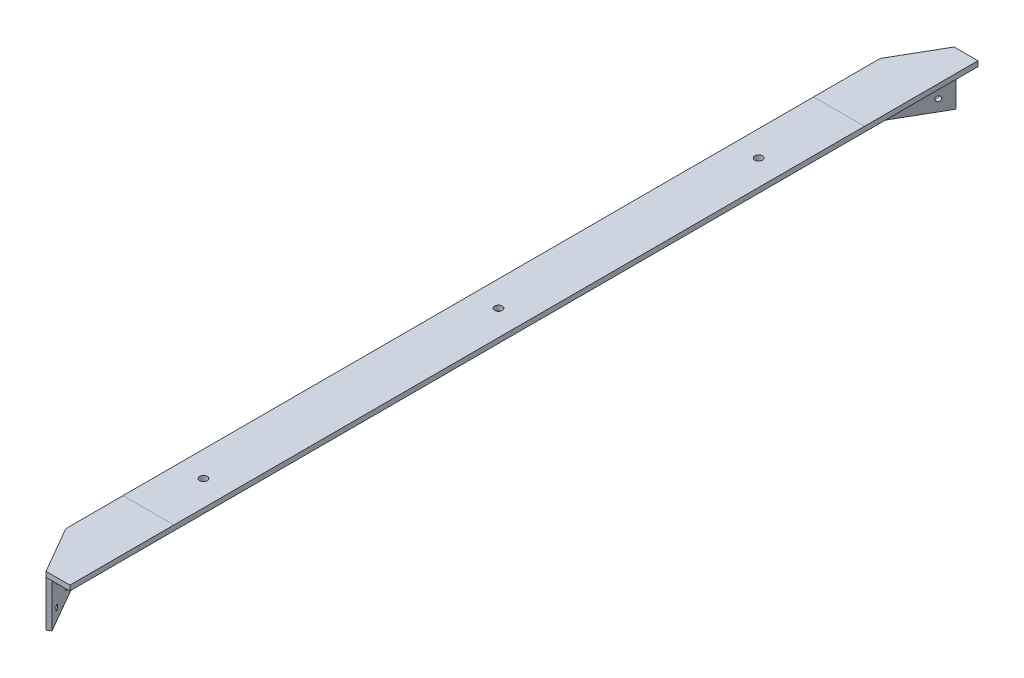
ISO-10303-21;
HEADER;
FILE_DESCRIPTION(('STEP AP214'),'2;1');
FILE_NAME('part.step','',(''),(''),'','','');
FILE_SCHEMA(('AUTOMOTIVE_DESIGN { 1 0 10303 214 1 1 1 1 }'));
ENDSEC;
DATA;
#1=APPLICATION_CONTEXT('core data for automotive mechanical design processes');
#2=APPLICATION_PROTOCOL_DEFINITION('international standard','automotive_design',2000,#1);
#3=PRODUCT_CONTEXT('',#1,'mechanical');
#4=PRODUCT('Part','Part','',(#3));
#5=PRODUCT_RELATED_PRODUCT_CATEGORY('part','',(#4));
#6=PRODUCT_DEFINITION_FORMATION('','',#4);
#7=PRODUCT_DEFINITION_CONTEXT('part definition',#1,'design');
#8=PRODUCT_DEFINITION('design','',#6,#7);
#9=PRODUCT_DEFINITION_SHAPE('','',#8);
#10=(LENGTH_UNIT() NAMED_UNIT(*) SI_UNIT(.MILLI.,.METRE.));
#11=(NAMED_UNIT(*) PLANE_ANGLE_UNIT() SI_UNIT($,.RADIAN.));
#12=(NAMED_UNIT(*) SI_UNIT($,.STERADIAN.) SOLID_ANGLE_UNIT());
#13=UNCERTAINTY_MEASURE_WITH_UNIT(LENGTH_MEASURE(1.E-05),#10,'distance_accuracy_value','');
#14=(GEOMETRIC_REPRESENTATION_CONTEXT(3) GLOBAL_UNCERTAINTY_ASSIGNED_CONTEXT((#13)) GLOBAL_UNIT_ASSIGNED_CONTEXT((#10,
#11,#12)) REPRESENTATION_CONTEXT('',''));
#15=CARTESIAN_POINT('',(0.,0.,0.));
#16=DIRECTION('',(0.,0.,1.));
#17=DIRECTION('',(1.,0.,0.));
#18=AXIS2_PLACEMENT_3D('',#15,#16,#17);
#19=CARTESIAN_POINT('',(-7.99999999999999,8.00000000000001,640.));
#20=DIRECTION('',(0.,-1.,0.));
#21=DIRECTION('',(1.,0.,0.));
#22=AXIS2_PLACEMENT_3D('',#19,#20,#21);
#23=PLANE('',#22);
#24=DIRECTION('',(1.,0.,0.));
#25=VECTOR('',#24,1.);
#26=CARTESIAN_POINT('',(-7.99999999999999,8.00000000000001,550.110508075689));
#27=LINE('',#26,#25);
#28=CARTESIAN_POINT('',(-7.99999999999999,8.00000000000001,550.110508075689));
#29=VERTEX_POINT('',#28);
#30=CARTESIAN_POINT('',(72.,8.00000000000001,550.110508075689));
#31=VERTEX_POINT('',#30);
#32=EDGE_CURVE('E11',#29,#31,#27,.T.);
#33=ORIENTED_EDGE('',*,*,#32,.F.);
#34=DIRECTION('',(0.,0.,-1.));
#35=VECTOR('',#34,1.);
#36=CARTESIAN_POINT('',(-7.99999999999999,8.00000000000001,640.));
#37=LINE('',#36,#35);
#38=CARTESIAN_POINT('',(-7.99999999999999,8.00000000000001,637.320508075689));
#39=VERTEX_POINT('',#38);
#40=EDGE_CURVE('E288',#39,#29,#37,.T.);
#41=ORIENTED_EDGE('',*,*,#40,.F.);
#42=CARTESIAN_POINT('',(2.00000000000001,8.00000000000001,637.320508075689));
#43=DIRECTION('',(0.,-1.,0.));
#44=DIRECTION('',(1.,0.,0.));
#45=AXIS2_PLACEMENT_3D('',#42,#43,#44);
#46=CIRCLE('',#45,10.);
#47=CARTESIAN_POINT('',(-6.66025403784442,8.,642.320508075689));
#48=VERTEX_POINT('',#47);
#49=EDGE_CURVE('E311',#39,#48,#46,.F.);
#50=ORIENTED_EDGE('',*,*,#49,.T.);
#51=DIRECTION('',(0.499999999999995,0.,0.866025403784441));
#52=VECTOR('',#51,1.);
#53=CARTESIAN_POINT('',(-7.99999999999999,8.,640.));
#54=LINE('',#53,#52);
#55=CARTESIAN_POINT('',(34.4999999999996,8.,713.612159321677));
#56=VERTEX_POINT('',#55);
#57=EDGE_CURVE('E274',#48,#56,#54,.T.);
#58=ORIENTED_EDGE('',*,*,#57,.T.);
#59=DIRECTION('',(1.,0.,0.));
#60=VECTOR('',#59,1.);
#61=CARTESIAN_POINT('',(34.4999999999996,8.,713.612159321677));
#62=LINE('',#61,#60);
#63=CARTESIAN_POINT('',(72.,8.,713.612159321677));
#64=VERTEX_POINT('',#63);
#65=EDGE_CURVE('E276',#56,#64,#62,.T.);
#66=ORIENTED_EDGE('',*,*,#65,.T.);
#67=DIRECTION('',(0.,0.,-1.));
#68=VECTOR('',#67,1.);
#69=CARTESIAN_POINT('',(72.,8.00000000000001,640.));
#70=LINE('',#69,#68);
#71=EDGE_CURVE('E293',#64,#31,#70,.T.);
#72=ORIENTED_EDGE('',*,*,#71,.T.);
#73=EDGE_LOOP('',(#33,#41,#50,#58,#66,#72));
#74=FACE_BOUND('',#73,.T.);
#75=ADVANCED_FACE('F45',(#74),#23,.F.);
#76=DIRECTION('',(-1.,0.,0.));
#77=VECTOR('',#76,1.);
#78=CARTESIAN_POINT('',(-7.99999999999999,8.00000000000001,-535.236189627764));
#79=LINE('',#78,#77);
#80=CARTESIAN_POINT('',(72.,8.00000000000001,-535.236189627764));
#81=VERTEX_POINT('',#80);
#82=CARTESIAN_POINT('',(-7.99999999999999,8.00000000000001,-535.236189627764));
#83=VERTEX_POINT('',#82);
#84=EDGE_CURVE('E54',#81,#83,#79,.T.);
#85=ORIENTED_EDGE('',*,*,#84,.F.);
#86=CARTESIAN_POINT('',(72.,8.,-713.612159321677));
#87=VERTEX_POINT('',#86);
#88=EDGE_CURVE('E291',#81,#87,#70,.T.);
#89=ORIENTED_EDGE('',*,*,#88,.T.);
#90=DIRECTION('',(1.,0.,0.));
#91=VECTOR('',#90,1.);
#92=CARTESIAN_POINT('',(34.4999999999996,8.,-713.612159321677));
#93=LINE('',#92,#91);
#94=CARTESIAN_POINT('',(34.4999999999996,8.,-713.612159321677));
#95=VERTEX_POINT('',#94);
#96=EDGE_CURVE('E221',#95,#87,#93,.T.);
#97=ORIENTED_EDGE('',*,*,#96,.F.);
#98=DIRECTION('',(0.499999999999995,0.,-0.866025403784441));
#99=VECTOR('',#98,1.);
#100=CARTESIAN_POINT('',(-7.99999999999999,8.,-640.));
#101=LINE('',#100,#99);
#102=CARTESIAN_POINT('',(-6.66025403784448,8.,-642.320508075689));
#103=VERTEX_POINT('',#102);
#104=EDGE_CURVE('E224',#103,#95,#101,.T.);
#105=ORIENTED_EDGE('',*,*,#104,.F.);
#106=CARTESIAN_POINT('',(2.00000000000001,8.00000000000001,-637.320508075689));
#107=DIRECTION('',(0.,-1.,0.));
#108=DIRECTION('',(1.,0.,0.));
#109=AXIS2_PLACEMENT_3D('',#106,#107,#108);
#110=CIRCLE('',#109,10.);
#111=CARTESIAN_POINT('',(-7.99999999999999,8.00000000000001,-637.320508075689));
#112=VERTEX_POINT('',#111);
#113=EDGE_CURVE('E348',#103,#112,#110,.F.);
#114=ORIENTED_EDGE('',*,*,#113,.T.);
#115=EDGE_CURVE('E287',#83,#112,#37,.T.);
#116=ORIENTED_EDGE('',*,*,#115,.F.);
#117=EDGE_LOOP('',(#85,#89,#97,#105,#114,#116));
#118=FACE_BOUND('',#117,.T.);
#119=ADVANCED_FACE('F386',(#118),#23,.F.);
#120=CARTESIAN_POINT('',(72.,0.,640.));
#121=DIRECTION('',(0.,1.,0.));
#122=DIRECTION('',(-1.,0.,0.));
#123=AXIS2_PLACEMENT_3D('',#120,#121,#122);
#124=PLANE('',#123);
#125=CARTESIAN_POINT('',(32.,0.,-408.889903619654));
#126=DIRECTION('',(0.,1.,0.));
#127=DIRECTION('',(-1.,0.,0.));
#128=AXIS2_PLACEMENT_3D('',#125,#126,#127);
#129=CIRCLE('',#128,6.00000000000001);
#130=CARTESIAN_POINT('',(26.,0.,-408.889903619654));
#131=VERTEX_POINT('',#130);
#132=EDGE_CURVE('E378',#131,#131,#129,.T.);
#133=ORIENTED_EDGE('',*,*,#132,.T.);
#134=EDGE_LOOP('',(#133));
#135=FACE_BOUND('',#134,.T.);
#136=CARTESIAN_POINT('',(32.,0.,0.));
#137=DIRECTION('',(0.,1.,0.));
#138=DIRECTION('',(-1.,0.,0.));
#139=AXIS2_PLACEMENT_3D('',#136,#137,#138);
#140=CIRCLE('',#139,5.99999999999999);
#141=CARTESIAN_POINT('',(26.,0.,0.));
#142=VERTEX_POINT('',#141);
#143=EDGE_CURVE('E509',#142,#142,#140,.T.);
#144=ORIENTED_EDGE('',*,*,#143,.T.);
#145=EDGE_LOOP('',(#144));
#146=FACE_BOUND('',#145,.T.);
#147=CARTESIAN_POINT('',(32.,0.,463.612159321678));
#148=DIRECTION('',(0.,1.,0.));
#149=DIRECTION('',(-1.,0.,0.));
#150=AXIS2_PLACEMENT_3D('',#147,#148,#149);
#151=CIRCLE('',#150,6.00000000000001);
#152=CARTESIAN_POINT('',(26.,0.,463.612159321678));
#153=VERTEX_POINT('',#152);
#154=EDGE_CURVE('E510',#153,#153,#151,.T.);
#155=ORIENTED_EDGE('',*,*,#154,.T.);
#156=EDGE_LOOP('',(#155));
#157=FACE_BOUND('',#156,.T.);
#158=DIRECTION('',(0.,0.,-1.));
#159=VECTOR('',#158,1.);
#160=CARTESIAN_POINT('',(8.00000000000001,0.,0.));
#161=LINE('',#160,#159);
#162=CARTESIAN_POINT('',(8.,0.,637.320508075689));
#163=VERTEX_POINT('',#162);
#164=CARTESIAN_POINT('',(8.00000000000001,0.,0.));
#165=VERTEX_POINT('',#164);
#166=EDGE_CURVE('E324',#163,#165,#161,.T.);
#167=ORIENTED_EDGE('',*,*,#166,.T.);
#168=DIRECTION('',(0.,0.,1.));
#169=VECTOR('',#168,1.);
#170=CARTESIAN_POINT('',(8.,0.,-637.320508075689));
#171=LINE('',#170,#169);
#172=CARTESIAN_POINT('',(8.,0.,-637.320508075689));
#173=VERTEX_POINT('',#172);
#174=EDGE_CURVE('E366',#165,#173,#171,.F.);
#175=ORIENTED_EDGE('',*,*,#174,.T.);
#176=CARTESIAN_POINT('',(10.,0.,-637.320508075689));
#177=DIRECTION('',(0.,1.,0.));
#178=DIRECTION('',(-1.,0.,0.));
#179=AXIS2_PLACEMENT_3D('',#176,#177,#178);
#180=CIRCLE('',#179,2.);
#181=CARTESIAN_POINT('',(8.26794919243096,0.,-638.320508075689));
#182=VERTEX_POINT('',#181);
#183=EDGE_CURVE('E364',#173,#182,#180,.F.);
#184=ORIENTED_EDGE('',*,*,#183,.T.);
#185=DIRECTION('',(0.499999999999996,0.,-0.866025403784441));
#186=VECTOR('',#185,1.);
#187=CARTESIAN_POINT('',(-529.328055191762,0.,292.823085463766));
#188=LINE('',#187,#186);
#189=CARTESIAN_POINT('',(47.4282032302751,0.,-706.14805770654));
#190=VERTEX_POINT('',#189);
#191=EDGE_CURVE('E361',#182,#190,#188,.T.);
#192=ORIENTED_EDGE('',*,*,#191,.T.);
#193=DIRECTION('',(-0.866025403784439,0.,-0.5));
#194=VECTOR('',#193,1.);
#195=CARTESIAN_POINT('',(34.4999999999996,0.,-713.612159321677));
#196=LINE('',#195,#194);
#197=CARTESIAN_POINT('',(34.4999999999996,0.,-713.612159321677));
#198=VERTEX_POINT('',#197);
#199=EDGE_CURVE('E208',#190,#198,#196,.T.);
#200=ORIENTED_EDGE('',*,*,#199,.T.);
#201=DIRECTION('',(1.,0.,0.));
#202=VECTOR('',#201,1.);
#203=CARTESIAN_POINT('',(34.4999999999996,0.,-713.612159321677));
#204=LINE('',#203,#202);
#205=CARTESIAN_POINT('',(72.,0.,-713.612159321677));
#206=VERTEX_POINT('',#205);
#207=EDGE_CURVE('E198',#198,#206,#204,.T.);
#208=ORIENTED_EDGE('',*,*,#207,.T.);
#209=DIRECTION('',(0.,0.,-1.));
#210=VECTOR('',#209,1.);
#211=CARTESIAN_POINT('',(72.,0.,640.));
#212=LINE('',#211,#210);
#213=CARTESIAN_POINT('',(72.,0.,713.612159321677));
#214=VERTEX_POINT('',#213);
#215=EDGE_CURVE('E296',#214,#206,#212,.T.);
#216=ORIENTED_EDGE('',*,*,#215,.F.);
#217=DIRECTION('',(1.,0.,0.));
#218=VECTOR('',#217,1.);
#219=CARTESIAN_POINT('',(34.4999999999996,0.,713.612159321677));
#220=LINE('',#219,#218);
#221=CARTESIAN_POINT('',(34.4999999999996,0.,713.612159321677));
#222=VERTEX_POINT('',#221);
#223=EDGE_CURVE('E273',#222,#214,#220,.T.);
#224=ORIENTED_EDGE('',*,*,#223,.F.);
#225=DIRECTION('',(-0.866025403784439,0.,0.5));
#226=VECTOR('',#225,1.);
#227=CARTESIAN_POINT('',(34.4999999999996,0.,713.612159321677));
#228=LINE('',#227,#226);
#229=CARTESIAN_POINT('',(47.4282032302752,0.,706.14805770654));
#230=VERTEX_POINT('',#229);
#231=EDGE_CURVE('E258',#230,#222,#228,.T.);
#232=ORIENTED_EDGE('',*,*,#231,.F.);
#233=DIRECTION('',(0.499999999999996,0.,0.866025403784441));
#234=VECTOR('',#233,1.);
#235=CARTESIAN_POINT('',(8.26794919243111,0.,638.320508075689));
#236=LINE('',#235,#234);
#237=CARTESIAN_POINT('',(8.26794919243111,0.,638.320508075689));
#238=VERTEX_POINT('',#237);
#239=EDGE_CURVE('E320',#230,#238,#236,.F.);
#240=ORIENTED_EDGE('',*,*,#239,.T.);
#241=CARTESIAN_POINT('',(10.,0.,637.320508075689));
#242=DIRECTION('',(0.,1.,0.));
#243=DIRECTION('',(-1.,0.,0.));
#244=AXIS2_PLACEMENT_3D('',#241,#242,#243);
#245=CIRCLE('',#244,2.);
#246=EDGE_CURVE('E322',#238,#163,#245,.F.);
#247=ORIENTED_EDGE('',*,*,#246,.T.);
#248=EDGE_LOOP('',(#167,#175,#184,#192,#200,#208,#216,#224,#232,#240,#247));
#249=FACE_BOUND('',#248,.T.);
#250=ADVANCED_FACE('F423',(#135,#146,#157,#249),#124,.F.);
#251=CARTESIAN_POINT('',(-8.,-72.,640.));
#252=DIRECTION('',(1.,0.,0.));
#253=DIRECTION('',(0.,1.,0.));
#254=AXIS2_PLACEMENT_3D('',#251,#252,#253);
#255=PLANE('',#254);
#256=ORIENTED_EDGE('',*,*,#40,.T.);
#257=EDGE_CURVE('E292',#29,#83,#37,.T.);
#258=ORIENTED_EDGE('',*,*,#257,.T.);
#259=ORIENTED_EDGE('',*,*,#115,.T.);
#260=DIRECTION('',(0.,-1.,0.));
#261=VECTOR('',#260,1.);
#262=CARTESIAN_POINT('',(-8.,-72.,-637.320508075689));
#263=LINE('',#262,#261);
#264=CARTESIAN_POINT('',(-8.,-72.,-637.320508075689));
#265=VERTEX_POINT('',#264);
#266=EDGE_CURVE('E338',#112,#265,#263,.T.);
#267=ORIENTED_EDGE('',*,*,#266,.T.);
#268=DIRECTION('',(0.,0.,-1.));
#269=VECTOR('',#268,1.);
#270=CARTESIAN_POINT('',(-8.,-72.,640.));
#271=LINE('',#270,#269);
#272=CARTESIAN_POINT('',(-8.,-72.,637.320508075689));
#273=VERTEX_POINT('',#272);
#274=EDGE_CURVE('E302',#273,#265,#271,.T.);
#275=ORIENTED_EDGE('',*,*,#274,.F.);
#276=DIRECTION('',(0.,-1.,0.));
#277=VECTOR('',#276,1.);
#278=CARTESIAN_POINT('',(-8.,-72.,637.320508075689));
#279=LINE('',#278,#277);
#280=EDGE_CURVE('E309',#273,#39,#279,.F.);
#281=ORIENTED_EDGE('',*,*,#280,.T.);
#282=EDGE_LOOP('',(#256,#258,#259,#267,#275,#281));
#283=FACE_BOUND('',#282,.T.);
#284=ADVANCED_FACE('F391',(#283),#255,.F.);
#285=CARTESIAN_POINT('',(0.,-72.,640.));
#286=DIRECTION('',(0.,1.,0.));
#287=DIRECTION('',(0.,0.,1.));
#288=AXIS2_PLACEMENT_3D('',#285,#286,#287);
#289=PLANE('',#288);
#290=ORIENTED_EDGE('',*,*,#274,.T.);
#291=CARTESIAN_POINT('',(2.,-72.,-637.320508075689));
#292=DIRECTION('',(0.,1.,0.));
#293=DIRECTION('',(0.,0.,1.));
#294=AXIS2_PLACEMENT_3D('',#291,#292,#293);
#295=CIRCLE('',#294,10.);
#296=CARTESIAN_POINT('',(-6.66025403784449,-72.,-642.320508075689));
#297=VERTEX_POINT('',#296);
#298=EDGE_CURVE('E207',#265,#297,#295,.F.);
#299=ORIENTED_EDGE('',*,*,#298,.T.);
#300=DIRECTION('',(-0.499999999999996,0.,0.866025403784441));
#301=VECTOR('',#300,1.);
#302=CARTESIAN_POINT('',(-8.,-72.,-640.));
#303=LINE('',#302,#301);
#304=CARTESIAN_POINT('',(34.4999999999996,-72.,-713.612159321677));
#305=VERTEX_POINT('',#304);
#306=EDGE_CURVE('E191',#305,#297,#303,.T.);
#307=ORIENTED_EDGE('',*,*,#306,.F.);
#308=DIRECTION('',(-0.866025403784439,0.,-0.5));
#309=VECTOR('',#308,1.);
#310=CARTESIAN_POINT('',(34.4999999999996,-72.,-713.612159321677));
#311=LINE('',#310,#309);
#312=CARTESIAN_POINT('',(40.4999999999997,-72.,-710.14805770654));
#313=VERTEX_POINT('',#312);
#314=EDGE_CURVE('E206',#313,#305,#311,.T.);
#315=ORIENTED_EDGE('',*,*,#314,.F.);
#316=DIRECTION('',(0.499999999999996,0.,-0.866025403784441));
#317=VECTOR('',#316,1.);
#318=CARTESIAN_POINT('',(40.4999999999997,-72.,-710.14805770654));
#319=LINE('',#318,#317);
#320=CARTESIAN_POINT('',(1.33974596215551,-72.,-642.320508075689));
#321=VERTEX_POINT('',#320);
#322=EDGE_CURVE('E213',#321,#313,#319,.T.);
#323=ORIENTED_EDGE('',*,*,#322,.F.);
#324=CARTESIAN_POINT('',(10.,-72.,-637.320508075689));
#325=DIRECTION('',(0.,1.,0.));
#326=DIRECTION('',(0.,0.,1.));
#327=AXIS2_PLACEMENT_3D('',#324,#325,#326);
#328=CIRCLE('',#327,10.);
#329=CARTESIAN_POINT('',(0.,-72.,-637.320508075689));
#330=VERTEX_POINT('',#329);
#331=EDGE_CURVE('E356',#321,#330,#328,.T.);
#332=ORIENTED_EDGE('',*,*,#331,.T.);
#333=DIRECTION('',(0.,0.,-1.));
#334=VECTOR('',#333,1.);
#335=CARTESIAN_POINT('',(0.,-72.,640.));
#336=LINE('',#335,#334);
#337=CARTESIAN_POINT('',(0.,-72.,637.320508075689));
#338=VERTEX_POINT('',#337);
#339=EDGE_CURVE('E299',#338,#330,#336,.T.);
#340=ORIENTED_EDGE('',*,*,#339,.F.);
#341=CARTESIAN_POINT('',(10.,-72.,637.320508075689));
#342=DIRECTION('',(0.,1.,0.));
#343=DIRECTION('',(0.,0.,1.));
#344=AXIS2_PLACEMENT_3D('',#341,#342,#343);
#345=CIRCLE('',#344,10.);
#346=CARTESIAN_POINT('',(1.33974596215557,-72.,642.320508075689));
#347=VERTEX_POINT('',#346);
#348=EDGE_CURVE('E318',#338,#347,#345,.T.);
#349=ORIENTED_EDGE('',*,*,#348,.T.);
#350=DIRECTION('',(0.499999999999996,0.,0.866025403784441));
#351=VECTOR('',#350,1.);
#352=CARTESIAN_POINT('',(40.4999999999997,-72.,710.14805770654));
#353=LINE('',#352,#351);
#354=CARTESIAN_POINT('',(40.4999999999997,-72.,710.14805770654));
#355=VERTEX_POINT('',#354);
#356=EDGE_CURVE('E259',#347,#355,#353,.T.);
#357=ORIENTED_EDGE('',*,*,#356,.T.);
#358=DIRECTION('',(-0.866025403784439,0.,0.5));
#359=VECTOR('',#358,1.);
#360=CARTESIAN_POINT('',(34.4999999999996,-72.,713.612159321677));
#361=LINE('',#360,#359);
#362=CARTESIAN_POINT('',(34.4999999999996,-72.,713.612159321677));
#363=VERTEX_POINT('',#362);
#364=EDGE_CURVE('E261',#355,#363,#361,.T.);
#365=ORIENTED_EDGE('',*,*,#364,.T.);
#366=DIRECTION('',(-0.499999999999996,0.,-0.866025403784441));
#367=VECTOR('',#366,1.);
#368=CARTESIAN_POINT('',(-8.,-72.,640.));
#369=LINE('',#368,#367);
#370=CARTESIAN_POINT('',(-6.66025403784442,-72.,642.320508075689));
#371=VERTEX_POINT('',#370);
#372=EDGE_CURVE('E263',#363,#371,#369,.T.);
#373=ORIENTED_EDGE('',*,*,#372,.T.);
#374=CARTESIAN_POINT('',(2.,-72.,637.320508075689));
#375=DIRECTION('',(0.,1.,0.));
#376=DIRECTION('',(0.,0.,1.));
#377=AXIS2_PLACEMENT_3D('',#374,#375,#376);
#378=CIRCLE('',#377,10.);
#379=EDGE_CURVE('E307',#371,#273,#378,.F.);
#380=ORIENTED_EDGE('',*,*,#379,.T.);
#381=EDGE_LOOP('',(#290,#299,#307,#315,#323,#332,#340,#349,#357,#365,#373,#380));
#382=FACE_BOUND('',#381,.T.);
#383=ADVANCED_FACE('F204',(#382),#289,.F.);
#384=CARTESIAN_POINT('',(0.,0.,640.));
#385=DIRECTION('',(-1.,0.,0.));
#386=DIRECTION('',(0.,-1.,0.));
#387=AXIS2_PLACEMENT_3D('',#384,#385,#386);
#388=PLANE('',#387);
#389=DIRECTION('',(0.,1.,0.));
#390=VECTOR('',#389,1.);
#391=CARTESIAN_POINT('',(0.,0.,-637.320508075689));
#392=LINE('',#391,#390);
#393=CARTESIAN_POINT('',(0.,-8.,-637.320508075689));
#394=VERTEX_POINT('',#393);
#395=EDGE_CURVE('E351',#330,#394,#392,.T.);
#396=ORIENTED_EDGE('',*,*,#395,.T.);
#397=DIRECTION('',(0.,0.,1.));
#398=VECTOR('',#397,1.);
#399=CARTESIAN_POINT('',(0.,-8.,0.));
#400=LINE('',#399,#398);
#401=CARTESIAN_POINT('',(0.,-8.,0.));
#402=VERTEX_POINT('',#401);
#403=EDGE_CURVE('E358',#394,#402,#400,.T.);
#404=ORIENTED_EDGE('',*,*,#403,.T.);
#405=DIRECTION('',(0.,0.,-1.));
#406=VECTOR('',#405,1.);
#407=CARTESIAN_POINT('',(0.,-8.,637.320508075689));
#408=LINE('',#407,#406);
#409=CARTESIAN_POINT('',(0.,-8.00000000000001,637.320508075689));
#410=VERTEX_POINT('',#409);
#411=EDGE_CURVE('E327',#402,#410,#408,.F.);
#412=ORIENTED_EDGE('',*,*,#411,.T.);
#413=DIRECTION('',(0.,1.,0.));
#414=VECTOR('',#413,1.);
#415=CARTESIAN_POINT('',(0.,-72.,637.320508075689));
#416=LINE('',#415,#414);
#417=EDGE_CURVE('E316',#410,#338,#416,.F.);
#418=ORIENTED_EDGE('',*,*,#417,.T.);
#419=ORIENTED_EDGE('',*,*,#339,.T.);
#420=EDGE_LOOP('',(#396,#404,#412,#418,#419));
#421=FACE_BOUND('',#420,.T.);
#422=ADVANCED_FACE('F443',(#421),#388,.F.);
#423=CARTESIAN_POINT('',(72.,8.00000000000001,640.));
#424=DIRECTION('',(-1.,0.,0.));
#425=DIRECTION('',(0.,0.,1.));
#426=AXIS2_PLACEMENT_3D('',#423,#424,#425);
#427=PLANE('',#426);
#428=ORIENTED_EDGE('',*,*,#215,.T.);
#429=DIRECTION('',(0.,-1.,0.));
#430=VECTOR('',#429,1.);
#431=CARTESIAN_POINT('',(72.,8.,-713.612159321677));
#432=LINE('',#431,#430);
#433=EDGE_CURVE('E229',#87,#206,#432,.T.);
#434=ORIENTED_EDGE('',*,*,#433,.F.);
#435=ORIENTED_EDGE('',*,*,#88,.F.);
#436=EDGE_CURVE('E297',#31,#81,#70,.T.);
#437=ORIENTED_EDGE('',*,*,#436,.F.);
#438=ORIENTED_EDGE('',*,*,#71,.F.);
#439=DIRECTION('',(0.,-1.,0.));
#440=VECTOR('',#439,1.);
#441=CARTESIAN_POINT('',(72.,8.,713.612159321677));
#442=LINE('',#441,#440);
#443=EDGE_CURVE('E279',#64,#214,#442,.T.);
#444=ORIENTED_EDGE('',*,*,#443,.T.);
#445=EDGE_LOOP('',(#428,#434,#435,#437,#438,#444));
#446=FACE_BOUND('',#445,.T.);
#447=ADVANCED_FACE('F417',(#446),#427,.F.);
#448=CARTESIAN_POINT('',(32.,8.00000000000001,-408.889903619654));
#449=DIRECTION('',(0.,1.,0.));
#450=DIRECTION('',(-1.,0.,0.));
#451=AXIS2_PLACEMENT_3D('',#448,#449,#450);
#452=CIRCLE('',#451,6.00000000000001);
#453=CARTESIAN_POINT('',(26.,8.00000000000001,-408.889903619654));
#454=VERTEX_POINT('',#453);
#455=EDGE_CURVE('E500',#454,#454,#452,.T.);
#456=ORIENTED_EDGE('',*,*,#455,.F.);
#457=EDGE_LOOP('',(#456));
#458=FACE_BOUND('',#457,.T.);
#459=CARTESIAN_POINT('',(32.,8.00000000000001,0.));
#460=DIRECTION('',(0.,1.,0.));
#461=DIRECTION('',(-1.,0.,0.));
#462=AXIS2_PLACEMENT_3D('',#459,#460,#461);
#463=CIRCLE('',#462,5.99999999999999);
#464=CARTESIAN_POINT('',(26.,8.00000000000001,0.));
#465=VERTEX_POINT('',#464);
#466=EDGE_CURVE('E504',#465,#465,#463,.T.);
#467=ORIENTED_EDGE('',*,*,#466,.F.);
#468=EDGE_LOOP('',(#467));
#469=FACE_BOUND('',#468,.T.);
#470=CARTESIAN_POINT('',(32.,8.00000000000001,463.612159321678));
#471=DIRECTION('',(0.,1.,0.));
#472=DIRECTION('',(-1.,0.,0.));
#473=AXIS2_PLACEMENT_3D('',#470,#471,#472);
#474=CIRCLE('',#473,6.00000000000001);
#475=CARTESIAN_POINT('',(26.,8.00000000000001,463.612159321678));
#476=VERTEX_POINT('',#475);
#477=EDGE_CURVE('E507',#476,#476,#474,.T.);
#478=ORIENTED_EDGE('',*,*,#477,.F.);
#479=EDGE_LOOP('',(#478));
#480=FACE_BOUND('',#479,.T.);
#481=ORIENTED_EDGE('',*,*,#257,.F.);
#482=ORIENTED_EDGE('',*,*,#32,.T.);
#483=ORIENTED_EDGE('',*,*,#436,.T.);
#484=ORIENTED_EDGE('',*,*,#84,.T.);
#485=EDGE_LOOP('',(#481,#482,#483,#484));
#486=FACE_BOUND('',#485,.T.);
#487=ADVANCED_FACE('F384',(#458,#469,#480,#486),#23,.F.);
#488=CARTESIAN_POINT('',(-7.99999999999999,8.,640.));
#489=DIRECTION('',(0.866025403784441,0.,-0.499999999999995));
#490=DIRECTION('',(-0.499999999999995,0.,-0.866025403784441));
#491=AXIS2_PLACEMENT_3D('',#488,#489,#490);
#492=PLANE('',#491);
#493=CARTESIAN_POINT('',(24.3749999999998,-54.,696.075144895043));
#494=DIRECTION('',(0.866025403784441,0.,-0.499999999999995));
#495=DIRECTION('',(-0.499999999999995,0.,-0.866025403784441));
#496=AXIS2_PLACEMENT_3D('',#493,#494,#495);
#497=CIRCLE('',#496,4.00000000000006);
#498=CARTESIAN_POINT('',(22.3749999999998,-54.,692.611043279905));
#499=VERTEX_POINT('',#498);
#500=EDGE_CURVE('E255',#499,#499,#497,.T.);
#501=ORIENTED_EDGE('',*,*,#500,.T.);
#502=EDGE_LOOP('',(#501));
#503=FACE_BOUND('',#502,.T.);
#504=CARTESIAN_POINT('',(4.12499999999999,-54.,661.001116041773));
#505=DIRECTION('',(0.866025403784441,0.,-0.499999999999995));
#506=DIRECTION('',(-0.499999999999995,0.,-0.866025403784441));
#507=AXIS2_PLACEMENT_3D('',#504,#505,#506);
#508=CIRCLE('',#507,3.99999999999997);
#509=CARTESIAN_POINT('',(2.12500000000002,-54.,657.537014426635));
#510=VERTEX_POINT('',#509);
#511=EDGE_CURVE('E252',#510,#510,#508,.T.);
#512=ORIENTED_EDGE('',*,*,#511,.T.);
#513=EDGE_LOOP('',(#512));
#514=FACE_BOUND('',#513,.T.);
#515=CARTESIAN_POINT('',(4.12499999999999,-18.,661.001116041773));
#516=DIRECTION('',(0.866025403784441,0.,-0.499999999999995));
#517=DIRECTION('',(-0.499999999999995,0.,-0.866025403784441));
#518=AXIS2_PLACEMENT_3D('',#515,#516,#517);
#519=CIRCLE('',#518,3.99999999999997);
#520=CARTESIAN_POINT('',(2.12500000000002,-18.,657.537014426635));
#521=VERTEX_POINT('',#520);
#522=EDGE_CURVE('E249',#521,#521,#519,.T.);
#523=ORIENTED_EDGE('',*,*,#522,.T.);
#524=EDGE_LOOP('',(#523));
#525=FACE_BOUND('',#524,.T.);
#526=CARTESIAN_POINT('',(24.3749999999998,-18.,696.075144895043));
#527=DIRECTION('',(0.866025403784441,0.,-0.499999999999995));
#528=DIRECTION('',(-0.499999999999995,0.,-0.866025403784441));
#529=AXIS2_PLACEMENT_3D('',#526,#527,#528);
#530=CIRCLE('',#529,4.00000000000006);
#531=CARTESIAN_POINT('',(22.3749999999998,-18.,692.611043279905));
#532=VERTEX_POINT('',#531);
#533=EDGE_CURVE('E246',#532,#532,#530,.T.);
#534=ORIENTED_EDGE('',*,*,#533,.T.);
#535=EDGE_LOOP('',(#534));
#536=FACE_BOUND('',#535,.T.);
#537=ORIENTED_EDGE('',*,*,#57,.F.);
#538=DIRECTION('',(0.,-1.,0.));
#539=VECTOR('',#538,1.);
#540=CARTESIAN_POINT('',(-6.66025403784442,8.,642.320508075689));
#541=LINE('',#540,#539);
#542=EDGE_CURVE('E304',#48,#371,#541,.T.);
#543=ORIENTED_EDGE('',*,*,#542,.T.);
#544=ORIENTED_EDGE('',*,*,#372,.F.);
#545=DIRECTION('',(0.,1.,0.));
#546=VECTOR('',#545,1.);
#547=CARTESIAN_POINT('',(34.4999999999996,-72.,713.612159321677));
#548=LINE('',#547,#546);
#549=EDGE_CURVE('E266',#363,#222,#548,.T.);
#550=ORIENTED_EDGE('',*,*,#549,.T.);
#551=DIRECTION('',(0.,-1.,0.));
#552=VECTOR('',#551,1.);
#553=CARTESIAN_POINT('',(34.4999999999996,8.,713.612159321677));
#554=LINE('',#553,#552);
#555=EDGE_CURVE('E284',#56,#222,#554,.T.);
#556=ORIENTED_EDGE('',*,*,#555,.F.);
#557=EDGE_LOOP('',(#537,#543,#544,#550,#556));
#558=FACE_BOUND('',#557,.T.);
#559=ADVANCED_FACE('F403',(#503,#514,#525,#536,#558),#492,.F.);
#560=CARTESIAN_POINT('',(34.4999999999996,8.,713.612159321677));
#561=DIRECTION('',(0.,0.,-1.));
#562=DIRECTION('',(-1.,0.,0.));
#563=AXIS2_PLACEMENT_3D('',#560,#561,#562);
#564=PLANE('',#563);
#565=ORIENTED_EDGE('',*,*,#223,.T.);
#566=ORIENTED_EDGE('',*,*,#443,.F.);
#567=ORIENTED_EDGE('',*,*,#65,.F.);
#568=ORIENTED_EDGE('',*,*,#555,.T.);
#569=EDGE_LOOP('',(#565,#566,#567,#568));
#570=FACE_BOUND('',#569,.T.);
#571=ADVANCED_FACE('F415',(#570),#564,.F.);
#572=CARTESIAN_POINT('',(40.4999999999997,-72.,710.14805770654));
#573=DIRECTION('',(-0.866025403784441,0.,0.499999999999996));
#574=DIRECTION('',(0.499999999999996,0.,0.866025403784441));
#575=AXIS2_PLACEMENT_3D('',#572,#573,#574);
#576=PLANE('',#575);
#577=CARTESIAN_POINT('',(30.3749999999997,-54.,692.611043279905));
#578=DIRECTION('',(0.866025403784441,0.,-0.499999999999996));
#579=DIRECTION('',(0.499999999999996,0.,0.866025403784441));
#580=AXIS2_PLACEMENT_3D('',#577,#578,#579);
#581=CIRCLE('',#580,4.00000000000006);
#582=CARTESIAN_POINT('',(32.3749999999997,-54.,696.075144895043));
#583=VERTEX_POINT('',#582);
#584=EDGE_CURVE('E240',#583,#583,#581,.T.);
#585=ORIENTED_EDGE('',*,*,#584,.F.);
#586=EDGE_LOOP('',(#585));
#587=FACE_BOUND('',#586,.T.);
#588=CARTESIAN_POINT('',(10.1249999999999,-54.,657.537014426635));
#589=DIRECTION('',(0.866025403784441,0.,-0.499999999999996));
#590=DIRECTION('',(-0.499999999999996,0.,-0.866025403784441));
#591=AXIS2_PLACEMENT_3D('',#588,#589,#590);
#592=CIRCLE('',#591,3.99999999999997);
#593=CARTESIAN_POINT('',(8.12499999999997,-54.,654.072912811497));
#594=VERTEX_POINT('',#593);
#595=EDGE_CURVE('E237',#594,#594,#592,.T.);
#596=ORIENTED_EDGE('',*,*,#595,.F.);
#597=EDGE_LOOP('',(#596));
#598=FACE_BOUND('',#597,.T.);
#599=CARTESIAN_POINT('',(10.1249999999999,-18.,657.537014426635));
#600=DIRECTION('',(0.866025403784441,0.,-0.499999999999996));
#601=DIRECTION('',(0.499999999999996,0.,0.866025403784441));
#602=AXIS2_PLACEMENT_3D('',#599,#600,#601);
#603=CIRCLE('',#602,3.99999999999997);
#604=CARTESIAN_POINT('',(12.1249999999999,-18.,661.001116041773));
#605=VERTEX_POINT('',#604);
#606=EDGE_CURVE('E233',#605,#605,#603,.T.);
#607=ORIENTED_EDGE('',*,*,#606,.F.);
#608=EDGE_LOOP('',(#607));
#609=FACE_BOUND('',#608,.T.);
#610=CARTESIAN_POINT('',(30.3749999999997,-18.,692.611043279905));
#611=DIRECTION('',(0.866025403784441,0.,-0.499999999999996));
#612=DIRECTION('',(-0.499999999999996,0.,-0.866025403784441));
#613=AXIS2_PLACEMENT_3D('',#610,#611,#612);
#614=CIRCLE('',#613,4.00000000000006);
#615=CARTESIAN_POINT('',(28.3749999999997,-18.,689.146941664767));
#616=VERTEX_POINT('',#615);
#617=EDGE_CURVE('E236',#616,#616,#614,.T.);
#618=ORIENTED_EDGE('',*,*,#617,.F.);
#619=EDGE_LOOP('',(#618));
#620=FACE_BOUND('',#619,.T.);
#621=DIRECTION('',(0.,1.,0.));
#622=VECTOR('',#621,1.);
#623=CARTESIAN_POINT('',(1.33974596215556,0.,642.320508075689));
#624=LINE('',#623,#622);
#625=CARTESIAN_POINT('',(1.33974596215556,-8.,642.320508075689));
#626=VERTEX_POINT('',#625);
#627=EDGE_CURVE('E313',#347,#626,#624,.T.);
#628=ORIENTED_EDGE('',*,*,#627,.T.);
#629=DIRECTION('',(0.499999999999996,0.,0.866025403784441));
#630=VECTOR('',#629,1.);
#631=CARTESIAN_POINT('',(40.4999999999996,-7.99999999999999,710.14805770654));
#632=LINE('',#631,#630);
#633=CARTESIAN_POINT('',(40.4999999999997,-7.99999999999999,710.14805770654));
#634=VERTEX_POINT('',#633);
#635=EDGE_CURVE('E331',#626,#634,#632,.T.);
#636=ORIENTED_EDGE('',*,*,#635,.T.);
#637=DIRECTION('',(0.,1.,0.));
#638=VECTOR('',#637,1.);
#639=CARTESIAN_POINT('',(40.4999999999997,-72.,710.14805770654));
#640=LINE('',#639,#638);
#641=EDGE_CURVE('E270',#355,#634,#640,.T.);
#642=ORIENTED_EDGE('',*,*,#641,.F.);
#643=ORIENTED_EDGE('',*,*,#356,.F.);
#644=EDGE_LOOP('',(#628,#636,#642,#643));
#645=FACE_BOUND('',#644,.T.);
#646=ADVANCED_FACE('F454',(#587,#598,#609,#620,#645),#576,.F.);
#647=CARTESIAN_POINT('',(34.4999999999996,-72.,713.612159321677));
#648=DIRECTION('',(-0.5,0.,-0.866025403784439));
#649=DIRECTION('',(-0.866025403784439,0.,0.5));
#650=AXIS2_PLACEMENT_3D('',#647,#648,#649);
#651=PLANE('',#650);
#652=ORIENTED_EDGE('',*,*,#231,.T.);
#653=ORIENTED_EDGE('',*,*,#549,.F.);
#654=ORIENTED_EDGE('',*,*,#364,.F.);
#655=ORIENTED_EDGE('',*,*,#641,.T.);
#656=CARTESIAN_POINT('',(47.4282032302752,-7.99999999999999,706.14805770654));
#657=DIRECTION('',(-0.5,0.,-0.866025403784439));
#658=DIRECTION('',(-0.866025403784439,0.,0.5));
#659=AXIS2_PLACEMENT_3D('',#656,#657,#658);
#660=CIRCLE('',#659,8.);
#661=EDGE_CURVE('E335',#634,#230,#660,.T.);
#662=ORIENTED_EDGE('',*,*,#661,.T.);
#663=EDGE_LOOP('',(#652,#653,#654,#655,#662));
#664=FACE_BOUND('',#663,.T.);
#665=ADVANCED_FACE('F410',(#664),#651,.F.);
#666=CARTESIAN_POINT('',(23.4467967697242,-18.,696.611043279905));
#667=DIRECTION('',(0.866025403784441,0.,-0.499999999999996));
#668=DIRECTION('',(-0.499999999999996,0.,-0.866025403784441));
#669=AXIS2_PLACEMENT_3D('',#666,#667,#668);
#670=CYLINDRICAL_SURFACE('',#669,4.00000000000006);
#671=ORIENTED_EDGE('',*,*,#617,.T.);
#672=EDGE_LOOP('',(#671));
#673=FACE_BOUND('',#672,.T.);
#674=ORIENTED_EDGE('',*,*,#533,.F.);
#675=EDGE_LOOP('',(#674));
#676=FACE_BOUND('',#675,.T.);
#677=ADVANCED_FACE('F580',(#673,#676),#670,.F.);
#678=CARTESIAN_POINT('',(3.19679676972441,-18.,661.537014426635));
#679=DIRECTION('',(0.866025403784441,0.,-0.499999999999996));
#680=DIRECTION('',(-0.499999999999996,0.,-0.866025403784441));
#681=AXIS2_PLACEMENT_3D('',#678,#679,#680);
#682=CYLINDRICAL_SURFACE('',#681,3.99999999999997);
#683=ORIENTED_EDGE('',*,*,#606,.T.);
#684=EDGE_LOOP('',(#683));
#685=FACE_BOUND('',#684,.T.);
#686=ORIENTED_EDGE('',*,*,#522,.F.);
#687=EDGE_LOOP('',(#686));
#688=FACE_BOUND('',#687,.T.);
#689=ADVANCED_FACE('F576',(#685,#688),#682,.F.);
#690=CARTESIAN_POINT('',(3.19679676972441,-54.,661.537014426635));
#691=DIRECTION('',(0.866025403784441,0.,-0.499999999999996));
#692=DIRECTION('',(-0.499999999999996,0.,-0.866025403784441));
#693=AXIS2_PLACEMENT_3D('',#690,#691,#692);
#694=CYLINDRICAL_SURFACE('',#693,3.99999999999997);
#695=ORIENTED_EDGE('',*,*,#595,.T.);
#696=EDGE_LOOP('',(#695));
#697=FACE_BOUND('',#696,.T.);
#698=ORIENTED_EDGE('',*,*,#511,.F.);
#699=EDGE_LOOP('',(#698));
#700=FACE_BOUND('',#699,.T.);
#701=ADVANCED_FACE('F579',(#697,#700),#694,.F.);
#702=CARTESIAN_POINT('',(23.4467967697242,-54.,696.611043279905));
#703=DIRECTION('',(0.866025403784441,0.,-0.499999999999996));
#704=DIRECTION('',(-0.499999999999996,0.,-0.866025403784441));
#705=AXIS2_PLACEMENT_3D('',#702,#703,#704);
#706=CYLINDRICAL_SURFACE('',#705,4.00000000000006);
#707=ORIENTED_EDGE('',*,*,#584,.T.);
#708=EDGE_LOOP('',(#707));
#709=FACE_BOUND('',#708,.T.);
#710=ORIENTED_EDGE('',*,*,#500,.F.);
#711=EDGE_LOOP('',(#710));
#712=FACE_BOUND('',#711,.T.);
#713=ADVANCED_FACE('F584',(#709,#712),#706,.F.);
#714=CARTESIAN_POINT('',(2.00000000000001,8.,637.320508075689));
#715=DIRECTION('',(0.,-1.,0.));
#716=DIRECTION('',(0.,0.,-1.));
#717=AXIS2_PLACEMENT_3D('',#714,#715,#716);
#718=CYLINDRICAL_SURFACE('',#717,10.);
#719=ORIENTED_EDGE('',*,*,#49,.F.);
#720=ORIENTED_EDGE('',*,*,#280,.F.);
#721=ORIENTED_EDGE('',*,*,#379,.F.);
#722=ORIENTED_EDGE('',*,*,#542,.F.);
#723=EDGE_LOOP('',(#719,#720,#721,#722));
#724=FACE_BOUND('',#723,.T.);
#725=ADVANCED_FACE('F400',(#724),#718,.T.);
#726=CARTESIAN_POINT('',(10.,-72.,637.320508075689));
#727=DIRECTION('',(0.,-1.,0.));
#728=DIRECTION('',(1.,0.,0.));
#729=AXIS2_PLACEMENT_3D('',#726,#727,#728);
#730=CYLINDRICAL_SURFACE('',#729,10.);
#731=ORIENTED_EDGE('',*,*,#417,.F.);
#732=CARTESIAN_POINT('',(10.,-8.00000000000001,637.320508075689));
#733=DIRECTION('',(0.,1.,0.));
#734=DIRECTION('',(-1.,0.,0.));
#735=AXIS2_PLACEMENT_3D('',#732,#733,#734);
#736=CIRCLE('',#735,10.);
#737=EDGE_CURVE('E329',#410,#626,#736,.T.);
#738=ORIENTED_EDGE('',*,*,#737,.T.);
#739=ORIENTED_EDGE('',*,*,#627,.F.);
#740=ORIENTED_EDGE('',*,*,#348,.F.);
#741=EDGE_LOOP('',(#731,#738,#739,#740));
#742=FACE_BOUND('',#741,.T.);
#743=ADVANCED_FACE('F450',(#742),#730,.F.);
#744=CARTESIAN_POINT('',(47.4282032302752,-7.99999999999999,706.14805770654));
#745=DIRECTION('',(-0.499999999999996,0.,-0.866025403784441));
#746=DIRECTION('',(-0.866025403784441,0.,0.499999999999996));
#747=AXIS2_PLACEMENT_3D('',#744,#745,#746);
#748=CYLINDRICAL_SURFACE('',#747,8.);
#749=ORIENTED_EDGE('',*,*,#661,.F.);
#750=ORIENTED_EDGE('',*,*,#635,.F.);
#751=CARTESIAN_POINT('',(8.26794919243111,-8.,638.320508075689));
#752=DIRECTION('',(0.499999999999999,0.,0.866025403784439));
#753=DIRECTION('',(0.866025403784439,0.,-0.499999999999999));
#754=AXIS2_PLACEMENT_3D('',#751,#752,#753);
#755=CIRCLE('',#754,8.);
#756=EDGE_CURVE('E243',#238,#626,#755,.T.);
#757=ORIENTED_EDGE('',*,*,#756,.F.);
#758=ORIENTED_EDGE('',*,*,#239,.F.);
#759=EDGE_LOOP('',(#749,#750,#757,#758));
#760=FACE_BOUND('',#759,.T.);
#761=ADVANCED_FACE('F458',(#760),#748,.F.);
#762=CARTESIAN_POINT('',(10.,-8.00000000000001,637.320508075689));
#763=DIRECTION('',(0.,1.,0.));
#764=DIRECTION('',(-1.,0.,0.));
#765=AXIS2_PLACEMENT_3D('',#762,#763,#764);
#766=DEGENERATE_TOROIDAL_SURFACE('',#765,2.,8.,.T.);
#767=ORIENTED_EDGE('',*,*,#756,.T.);
#768=ORIENTED_EDGE('',*,*,#737,.F.);
#769=CARTESIAN_POINT('',(8.,-8.,637.320508075689));
#770=DIRECTION('',(0.,0.,1.));
#771=DIRECTION('',(1.,0.,0.));
#772=AXIS2_PLACEMENT_3D('',#769,#770,#771);
#773=CIRCLE('',#772,8.);
#774=EDGE_CURVE('E232',#163,#410,#773,.T.);
#775=ORIENTED_EDGE('',*,*,#774,.F.);
#776=ORIENTED_EDGE('',*,*,#246,.F.);
#777=EDGE_LOOP('',(#767,#768,#775,#776));
#778=FACE_BOUND('',#777,.T.);
#779=ADVANCED_FACE('F462',(#778),#766,.F.);
#780=CARTESIAN_POINT('',(8.00000000000001,-8.,640.));
#781=DIRECTION('',(0.,0.,1.));
#782=DIRECTION('',(1.,0.,0.));
#783=AXIS2_PLACEMENT_3D('',#780,#781,#782);
#784=CYLINDRICAL_SURFACE('',#783,8.);
#785=ORIENTED_EDGE('',*,*,#774,.T.);
#786=ORIENTED_EDGE('',*,*,#411,.F.);
#787=CARTESIAN_POINT('',(8.00000000000001,-8.,0.));
#788=DIRECTION('',(0.,0.,-1.));
#789=DIRECTION('',(-1.,0.,0.));
#790=AXIS2_PLACEMENT_3D('',#787,#788,#789);
#791=CIRCLE('',#790,8.);
#792=EDGE_CURVE('E333',#165,#402,#791,.F.);
#793=ORIENTED_EDGE('',*,*,#792,.F.);
#794=ORIENTED_EDGE('',*,*,#166,.F.);
#795=EDGE_LOOP('',(#785,#786,#793,#794));
#796=FACE_BOUND('',#795,.T.);
#797=ADVANCED_FACE('F469',(#796),#784,.F.);
#798=CARTESIAN_POINT('',(34.4999999999996,8.,-713.612159321677));
#799=DIRECTION('',(0.,0.,-1.));
#800=DIRECTION('',(-1.,0.,0.));
#801=AXIS2_PLACEMENT_3D('',#798,#799,#800);
#802=PLANE('',#801);
#803=ORIENTED_EDGE('',*,*,#207,.F.);
#804=DIRECTION('',(0.,-1.,0.));
#805=VECTOR('',#804,1.);
#806=CARTESIAN_POINT('',(34.4999999999996,8.,-713.612159321677));
#807=LINE('',#806,#805);
#808=EDGE_CURVE('E194',#95,#198,#807,.T.);
#809=ORIENTED_EDGE('',*,*,#808,.F.);
#810=ORIENTED_EDGE('',*,*,#96,.T.);
#811=ORIENTED_EDGE('',*,*,#433,.T.);
#812=EDGE_LOOP('',(#803,#809,#810,#811));
#813=FACE_BOUND('',#812,.T.);
#814=ADVANCED_FACE('F421',(#813),#802,.T.);
#815=CARTESIAN_POINT('',(-7.99999999999999,8.,-640.));
#816=DIRECTION('',(-0.866025403784441,0.,-0.499999999999995));
#817=DIRECTION('',(-0.499999999999995,0.,0.866025403784441));
#818=AXIS2_PLACEMENT_3D('',#815,#816,#817);
#819=PLANE('',#818);
#820=CARTESIAN_POINT('',(24.3749999999998,-54.,-696.075144895043));
#821=DIRECTION('',(-0.866025403784441,0.,-0.499999999999995));
#822=DIRECTION('',(-0.499999999999995,0.,0.866025403784441));
#823=AXIS2_PLACEMENT_3D('',#820,#821,#822);
#824=CIRCLE('',#823,4.00000000000006);
#825=CARTESIAN_POINT('',(22.3749999999998,-54.,-692.611043279905));
#826=VERTEX_POINT('',#825);
#827=EDGE_CURVE('E219',#826,#826,#824,.F.);
#828=ORIENTED_EDGE('',*,*,#827,.T.);
#829=EDGE_LOOP('',(#828));
#830=FACE_BOUND('',#829,.T.);
#831=CARTESIAN_POINT('',(4.12499999999999,-54.,-661.001116041773));
#832=DIRECTION('',(-0.866025403784441,0.,-0.499999999999995));
#833=DIRECTION('',(-0.499999999999995,0.,0.866025403784441));
#834=AXIS2_PLACEMENT_3D('',#831,#832,#833);
#835=CIRCLE('',#834,3.99999999999997);
#836=CARTESIAN_POINT('',(2.12500000000002,-54.,-657.537014426635));
#837=VERTEX_POINT('',#836);
#838=EDGE_CURVE('E535',#837,#837,#835,.F.);
#839=ORIENTED_EDGE('',*,*,#838,.T.);
#840=EDGE_LOOP('',(#839));
#841=FACE_BOUND('',#840,.T.);
#842=CARTESIAN_POINT('',(4.12499999999999,-18.,-661.001116041773));
#843=DIRECTION('',(-0.866025403784441,0.,-0.499999999999995));
#844=DIRECTION('',(-0.499999999999995,0.,0.866025403784441));
#845=AXIS2_PLACEMENT_3D('',#842,#843,#844);
#846=CIRCLE('',#845,3.99999999999997);
#847=CARTESIAN_POINT('',(2.12500000000002,-18.,-657.537014426635));
#848=VERTEX_POINT('',#847);
#849=EDGE_CURVE('E532',#848,#848,#846,.F.);
#850=ORIENTED_EDGE('',*,*,#849,.T.);
#851=EDGE_LOOP('',(#850));
#852=FACE_BOUND('',#851,.T.);
#853=CARTESIAN_POINT('',(24.3749999999998,-18.,-696.075144895043));
#854=DIRECTION('',(-0.866025403784441,0.,-0.499999999999995));
#855=DIRECTION('',(-0.499999999999995,0.,0.866025403784441));
#856=AXIS2_PLACEMENT_3D('',#853,#854,#855);
#857=CIRCLE('',#856,4.00000000000006);
#858=CARTESIAN_POINT('',(22.3749999999998,-18.,-692.611043279905));
#859=VERTEX_POINT('',#858);
#860=EDGE_CURVE('E529',#859,#859,#857,.F.);
#861=ORIENTED_EDGE('',*,*,#860,.T.);
#862=EDGE_LOOP('',(#861));
#863=FACE_BOUND('',#862,.T.);
#864=ORIENTED_EDGE('',*,*,#306,.T.);
#865=DIRECTION('',(0.,-1.,0.));
#866=VECTOR('',#865,1.);
#867=CARTESIAN_POINT('',(-6.66025403784448,8.00000000000001,-642.320508075689));
#868=LINE('',#867,#866);
#869=EDGE_CURVE('E346',#297,#103,#868,.F.);
#870=ORIENTED_EDGE('',*,*,#869,.T.);
#871=ORIENTED_EDGE('',*,*,#104,.T.);
#872=ORIENTED_EDGE('',*,*,#808,.T.);
#873=DIRECTION('',(0.,1.,0.));
#874=VECTOR('',#873,1.);
#875=CARTESIAN_POINT('',(34.4999999999996,-72.,-713.612159321677));
#876=LINE('',#875,#874);
#877=EDGE_CURVE('E188',#305,#198,#876,.T.);
#878=ORIENTED_EDGE('',*,*,#877,.F.);
#879=EDGE_LOOP('',(#864,#870,#871,#872,#878));
#880=FACE_BOUND('',#879,.T.);
#881=ADVANCED_FACE('F190',(#830,#841,#852,#863,#880),#819,.T.);
#882=CARTESIAN_POINT('',(34.4999999999996,-72.,-713.612159321677));
#883=DIRECTION('',(0.5,0.,-0.866025403784439));
#884=DIRECTION('',(-0.866025403784439,0.,-0.5));
#885=AXIS2_PLACEMENT_3D('',#882,#883,#884);
#886=PLANE('',#885);
#887=ORIENTED_EDGE('',*,*,#199,.F.);
#888=CARTESIAN_POINT('',(47.4282032302751,-7.99999999999999,-706.14805770654));
#889=DIRECTION('',(0.5,0.,-0.866025403784439));
#890=DIRECTION('',(-0.866025403784439,0.,-0.5));
#891=AXIS2_PLACEMENT_3D('',#888,#889,#890);
#892=CIRCLE('',#891,8.);
#893=CARTESIAN_POINT('',(40.4999999999997,-7.99999999999999,-710.14805770654));
#894=VERTEX_POINT('',#893);
#895=EDGE_CURVE('E372',#190,#894,#892,.F.);
#896=ORIENTED_EDGE('',*,*,#895,.T.);
#897=DIRECTION('',(0.,1.,0.));
#898=VECTOR('',#897,1.);
#899=CARTESIAN_POINT('',(40.4999999999997,-72.,-710.14805770654));
#900=LINE('',#899,#898);
#901=EDGE_CURVE('E199',#313,#894,#900,.T.);
#902=ORIENTED_EDGE('',*,*,#901,.F.);
#903=ORIENTED_EDGE('',*,*,#314,.T.);
#904=ORIENTED_EDGE('',*,*,#877,.T.);
#905=EDGE_LOOP('',(#887,#896,#902,#903,#904));
#906=FACE_BOUND('',#905,.T.);
#907=ADVANCED_FACE('F211',(#906),#886,.T.);
#908=CARTESIAN_POINT('',(40.4999999999997,-72.,-710.14805770654));
#909=DIRECTION('',(0.866025403784441,0.,0.499999999999996));
#910=DIRECTION('',(0.499999999999996,0.,-0.866025403784441));
#911=AXIS2_PLACEMENT_3D('',#908,#909,#910);
#912=PLANE('',#911);
#913=CARTESIAN_POINT('',(30.3749999999997,-54.,-692.611043279905));
#914=DIRECTION('',(-0.866025403784441,0.,-0.499999999999996));
#915=DIRECTION('',(0.499999999999996,0.,-0.866025403784441));
#916=AXIS2_PLACEMENT_3D('',#913,#914,#915);
#917=CIRCLE('',#916,4.00000000000006);
#918=CARTESIAN_POINT('',(32.3749999999997,-54.,-696.075144895043));
#919=VERTEX_POINT('',#918);
#920=EDGE_CURVE('E380',#919,#919,#917,.T.);
#921=ORIENTED_EDGE('',*,*,#920,.T.);
#922=EDGE_LOOP('',(#921));
#923=FACE_BOUND('',#922,.T.);
#924=CARTESIAN_POINT('',(10.1249999999999,-54.,-657.537014426635));
#925=DIRECTION('',(-0.866025403784441,0.,-0.499999999999996));
#926=DIRECTION('',(-0.499999999999996,0.,0.866025403784441));
#927=AXIS2_PLACEMENT_3D('',#924,#925,#926);
#928=CIRCLE('',#927,3.99999999999997);
#929=CARTESIAN_POINT('',(8.12499999999997,-54.,-654.072912811497));
#930=VERTEX_POINT('',#929);
#931=EDGE_CURVE('E522',#930,#930,#928,.T.);
#932=ORIENTED_EDGE('',*,*,#931,.T.);
#933=EDGE_LOOP('',(#932));
#934=FACE_BOUND('',#933,.T.);
#935=CARTESIAN_POINT('',(10.1249999999999,-18.,-657.537014426635));
#936=DIRECTION('',(-0.866025403784441,0.,-0.499999999999996));
#937=DIRECTION('',(0.499999999999996,0.,-0.866025403784441));
#938=AXIS2_PLACEMENT_3D('',#935,#936,#937);
#939=CIRCLE('',#938,3.99999999999997);
#940=CARTESIAN_POINT('',(12.1249999999999,-18.,-661.001116041773));
#941=VERTEX_POINT('',#940);
#942=EDGE_CURVE('E518',#941,#941,#939,.T.);
#943=ORIENTED_EDGE('',*,*,#942,.T.);
#944=EDGE_LOOP('',(#943));
#945=FACE_BOUND('',#944,.T.);
#946=CARTESIAN_POINT('',(30.3749999999997,-18.,-692.611043279905));
#947=DIRECTION('',(-0.866025403784441,0.,-0.499999999999996));
#948=DIRECTION('',(-0.499999999999996,0.,0.866025403784441));
#949=AXIS2_PLACEMENT_3D('',#946,#947,#948);
#950=CIRCLE('',#949,4.00000000000006);
#951=CARTESIAN_POINT('',(28.3749999999997,-18.,-689.146941664767));
#952=VERTEX_POINT('',#951);
#953=EDGE_CURVE('E521',#952,#952,#950,.T.);
#954=ORIENTED_EDGE('',*,*,#953,.T.);
#955=EDGE_LOOP('',(#954));
#956=FACE_BOUND('',#955,.T.);
#957=ORIENTED_EDGE('',*,*,#901,.T.);
#958=DIRECTION('',(0.499999999999996,0.,-0.866025403784441));
#959=VECTOR('',#958,1.);
#960=CARTESIAN_POINT('',(40.4999999999997,-7.99999999999999,-710.14805770654));
#961=LINE('',#960,#959);
#962=CARTESIAN_POINT('',(1.3397459621555,-7.99999999999999,-642.320508075689));
#963=VERTEX_POINT('',#962);
#964=EDGE_CURVE('E370',#894,#963,#961,.F.);
#965=ORIENTED_EDGE('',*,*,#964,.T.);
#966=DIRECTION('',(0.,1.,0.));
#967=VECTOR('',#966,1.);
#968=CARTESIAN_POINT('',(1.33974596215551,-72.,-642.320508075689));
#969=LINE('',#968,#967);
#970=EDGE_CURVE('E354',#963,#321,#969,.F.);
#971=ORIENTED_EDGE('',*,*,#970,.T.);
#972=ORIENTED_EDGE('',*,*,#322,.T.);
#973=EDGE_LOOP('',(#957,#965,#971,#972));
#974=FACE_BOUND('',#973,.T.);
#975=ADVANCED_FACE('F429',(#923,#934,#945,#956,#974),#912,.T.);
#976=CARTESIAN_POINT('',(23.4467967697242,-18.,-696.611043279905));
#977=DIRECTION('',(0.866025403784441,0.,0.499999999999996));
#978=DIRECTION('',(0.499999999999996,0.,-0.866025403784441));
#979=AXIS2_PLACEMENT_3D('',#976,#977,#978);
#980=CYLINDRICAL_SURFACE('',#979,4.00000000000006);
#981=ORIENTED_EDGE('',*,*,#860,.F.);
#982=EDGE_LOOP('',(#981));
#983=FACE_BOUND('',#982,.T.);
#984=ORIENTED_EDGE('',*,*,#953,.F.);
#985=EDGE_LOOP('',(#984));
#986=FACE_BOUND('',#985,.T.);
#987=ADVANCED_FACE('F552',(#983,#986),#980,.F.);
#988=CARTESIAN_POINT('',(3.19679676972441,-18.,-661.537014426635));
#989=DIRECTION('',(0.866025403784441,0.,0.499999999999996));
#990=DIRECTION('',(0.499999999999996,0.,-0.866025403784441));
#991=AXIS2_PLACEMENT_3D('',#988,#989,#990);
#992=CYLINDRICAL_SURFACE('',#991,3.99999999999997);
#993=ORIENTED_EDGE('',*,*,#849,.F.);
#994=EDGE_LOOP('',(#993));
#995=FACE_BOUND('',#994,.T.);
#996=ORIENTED_EDGE('',*,*,#942,.F.);
#997=EDGE_LOOP('',(#996));
#998=FACE_BOUND('',#997,.T.);
#999=ADVANCED_FACE('F561',(#995,#998),#992,.F.);
#1000=CARTESIAN_POINT('',(3.19679676972441,-54.,-661.537014426635));
#1001=DIRECTION('',(0.866025403784441,0.,0.499999999999996));
#1002=DIRECTION('',(0.499999999999996,0.,-0.866025403784441));
#1003=AXIS2_PLACEMENT_3D('',#1000,#1001,#1002);
#1004=CYLINDRICAL_SURFACE('',#1003,3.99999999999997);
#1005=ORIENTED_EDGE('',*,*,#838,.F.);
#1006=EDGE_LOOP('',(#1005));
#1007=FACE_BOUND('',#1006,.T.);
#1008=ORIENTED_EDGE('',*,*,#931,.F.);
#1009=EDGE_LOOP('',(#1008));
#1010=FACE_BOUND('',#1009,.T.);
#1011=ADVANCED_FACE('F546',(#1007,#1010),#1004,.F.);
#1012=CARTESIAN_POINT('',(23.4467967697242,-54.,-696.611043279905));
#1013=DIRECTION('',(0.866025403784441,0.,0.499999999999996));
#1014=DIRECTION('',(0.499999999999996,0.,-0.866025403784441));
#1015=AXIS2_PLACEMENT_3D('',#1012,#1013,#1014);
#1016=CYLINDRICAL_SURFACE('',#1015,4.00000000000006);
#1017=ORIENTED_EDGE('',*,*,#827,.F.);
#1018=EDGE_LOOP('',(#1017));
#1019=FACE_BOUND('',#1018,.T.);
#1020=ORIENTED_EDGE('',*,*,#920,.F.);
#1021=EDGE_LOOP('',(#1020));
#1022=FACE_BOUND('',#1021,.T.);
#1023=ADVANCED_FACE('F542',(#1019,#1022),#1016,.F.);
#1024=CARTESIAN_POINT('',(2.,-72.0000000000001,-637.320508075689));
#1025=DIRECTION('',(0.,1.,0.));
#1026=DIRECTION('',(0.,0.,1.));
#1027=AXIS2_PLACEMENT_3D('',#1024,#1025,#1026);
#1028=CYLINDRICAL_SURFACE('',#1027,10.);
#1029=ORIENTED_EDGE('',*,*,#113,.F.);
#1030=ORIENTED_EDGE('',*,*,#869,.F.);
#1031=ORIENTED_EDGE('',*,*,#298,.F.);
#1032=ORIENTED_EDGE('',*,*,#266,.F.);
#1033=EDGE_LOOP('',(#1029,#1030,#1031,#1032));
#1034=FACE_BOUND('',#1033,.T.);
#1035=ADVANCED_FACE('F545',(#1034),#1028,.T.);
#1036=CARTESIAN_POINT('',(10.,0.,-637.320508075689));
#1037=DIRECTION('',(0.,1.,0.));
#1038=DIRECTION('',(-1.,0.,0.));
#1039=AXIS2_PLACEMENT_3D('',#1036,#1037,#1038);
#1040=CYLINDRICAL_SURFACE('',#1039,10.);
#1041=ORIENTED_EDGE('',*,*,#970,.F.);
#1042=CARTESIAN_POINT('',(10.,-8.,-637.320508075689));
#1043=DIRECTION('',(0.,1.,0.));
#1044=DIRECTION('',(-1.,0.,0.));
#1045=AXIS2_PLACEMENT_3D('',#1042,#1043,#1044);
#1046=CIRCLE('',#1045,10.);
#1047=EDGE_CURVE('E368',#963,#394,#1046,.T.);
#1048=ORIENTED_EDGE('',*,*,#1047,.T.);
#1049=ORIENTED_EDGE('',*,*,#395,.F.);
#1050=ORIENTED_EDGE('',*,*,#331,.F.);
#1051=EDGE_LOOP('',(#1041,#1048,#1049,#1050));
#1052=FACE_BOUND('',#1051,.T.);
#1053=ADVANCED_FACE('F440',(#1052),#1040,.F.);
#1054=CARTESIAN_POINT('',(-529.328055191762,-8.00000000000006,292.823085463766));
#1055=DIRECTION('',(0.499999999999996,0.,-0.866025403784441));
#1056=DIRECTION('',(-0.866025403784441,0.,-0.499999999999996));
#1057=AXIS2_PLACEMENT_3D('',#1054,#1055,#1056);
#1058=CYLINDRICAL_SURFACE('',#1057,8.);
#1059=ORIENTED_EDGE('',*,*,#895,.F.);
#1060=ORIENTED_EDGE('',*,*,#191,.F.);
#1061=CARTESIAN_POINT('',(8.26794919243106,-8.,-638.320508075689));
#1062=DIRECTION('',(0.499999999999999,0.,-0.866025403784439));
#1063=DIRECTION('',(-0.866025403784439,0.,-0.499999999999999));
#1064=AXIS2_PLACEMENT_3D('',#1061,#1062,#1063);
#1065=CIRCLE('',#1064,8.);
#1066=EDGE_CURVE('E377',#963,#182,#1065,.T.);
#1067=ORIENTED_EDGE('',*,*,#1066,.F.);
#1068=ORIENTED_EDGE('',*,*,#964,.F.);
#1069=EDGE_LOOP('',(#1059,#1060,#1067,#1068));
#1070=FACE_BOUND('',#1069,.T.);
#1071=ADVANCED_FACE('F47',(#1070),#1058,.F.);
#1072=CARTESIAN_POINT('',(10.,-8.,-637.320508075689));
#1073=DIRECTION('',(0.,1.,0.));
#1074=DIRECTION('',(-1.,0.,0.));
#1075=AXIS2_PLACEMENT_3D('',#1072,#1073,#1074);
#1076=DEGENERATE_TOROIDAL_SURFACE('',#1075,2.,8.,.T.);
#1077=ORIENTED_EDGE('',*,*,#1066,.T.);
#1078=ORIENTED_EDGE('',*,*,#183,.F.);
#1079=CARTESIAN_POINT('',(8.,-8.,-637.320508075689));
#1080=DIRECTION('',(0.,0.,-1.));
#1081=DIRECTION('',(-1.,0.,0.));
#1082=AXIS2_PLACEMENT_3D('',#1079,#1080,#1081);
#1083=CIRCLE('',#1082,8.);
#1084=EDGE_CURVE('E374',#394,#173,#1083,.T.);
#1085=ORIENTED_EDGE('',*,*,#1084,.F.);
#1086=ORIENTED_EDGE('',*,*,#1047,.F.);
#1087=EDGE_LOOP('',(#1077,#1078,#1085,#1086));
#1088=FACE_BOUND('',#1087,.T.);
#1089=ADVANCED_FACE('F436',(#1088),#1076,.F.);
#1090=CARTESIAN_POINT('',(8.,-8.,640.));
#1091=DIRECTION('',(0.,0.,-1.));
#1092=DIRECTION('',(-1.,0.,0.));
#1093=AXIS2_PLACEMENT_3D('',#1090,#1091,#1092);
#1094=CYLINDRICAL_SURFACE('',#1093,8.);
#1095=ORIENTED_EDGE('',*,*,#1084,.T.);
#1096=ORIENTED_EDGE('',*,*,#174,.F.);
#1097=ORIENTED_EDGE('',*,*,#792,.T.);
#1098=ORIENTED_EDGE('',*,*,#403,.F.);
#1099=EDGE_LOOP('',(#1095,#1096,#1097,#1098));
#1100=FACE_BOUND('',#1099,.T.);
#1101=ADVANCED_FACE('F468',(#1100),#1094,.F.);
#1102=CARTESIAN_POINT('',(32.,0.,463.612159321678));
#1103=DIRECTION('',(0.,1.,0.));
#1104=DIRECTION('',(-1.,0.,0.));
#1105=AXIS2_PLACEMENT_3D('',#1102,#1103,#1104);
#1106=CYLINDRICAL_SURFACE('',#1105,6.00000000000001);
#1107=ORIENTED_EDGE('',*,*,#154,.F.);
#1108=EDGE_LOOP('',(#1107));
#1109=FACE_BOUND('',#1108,.T.);
#1110=ORIENTED_EDGE('',*,*,#477,.T.);
#1111=EDGE_LOOP('',(#1110));
#1112=FACE_BOUND('',#1111,.T.);
#1113=ADVANCED_FACE('F736',(#1109,#1112),#1106,.F.);
#1114=CARTESIAN_POINT('',(32.,0.,0.));
#1115=DIRECTION('',(0.,1.,0.));
#1116=DIRECTION('',(-1.,0.,0.));
#1117=AXIS2_PLACEMENT_3D('',#1114,#1115,#1116);
#1118=CYLINDRICAL_SURFACE('',#1117,5.99999999999999);
#1119=ORIENTED_EDGE('',*,*,#143,.F.);
#1120=EDGE_LOOP('',(#1119));
#1121=FACE_BOUND('',#1120,.T.);
#1122=ORIENTED_EDGE('',*,*,#466,.T.);
#1123=EDGE_LOOP('',(#1122));
#1124=FACE_BOUND('',#1123,.T.);
#1125=ADVANCED_FACE('F741',(#1121,#1124),#1118,.F.);
#1126=CARTESIAN_POINT('',(32.,0.,-408.889903619654));
#1127=DIRECTION('',(0.,1.,0.));
#1128=DIRECTION('',(-1.,0.,0.));
#1129=AXIS2_PLACEMENT_3D('',#1126,#1127,#1128);
#1130=CYLINDRICAL_SURFACE('',#1129,6.00000000000001);
#1131=ORIENTED_EDGE('',*,*,#132,.F.);
#1132=EDGE_LOOP('',(#1131));
#1133=FACE_BOUND('',#1132,.T.);
#1134=ORIENTED_EDGE('',*,*,#455,.T.);
#1135=EDGE_LOOP('',(#1134));
#1136=FACE_BOUND('',#1135,.T.);
#1137=ADVANCED_FACE('F751',(#1133,#1136),#1130,.F.);
#1138=CLOSED_SHELL('',(#75,#119,#250,#284,#383,#422,#447,#487,#559,#571,#646,#665,#677,#689,
#701,#713,#725,#743,#761,#779,#797,#814,#881,#907,#975,#987,#999,#1011,#1023,#1035,#1053,#1071,
#1089,#1101,#1113,#1125,#1137));
#1139=MANIFOLD_SOLID_BREP('B2',#1138);
#1140=ADVANCED_BREP_SHAPE_REPRESENTATION('',(#18,#1139),#14);
#1141=SHAPE_DEFINITION_REPRESENTATION(#9,#1140);
ENDSEC;
END-ISO-10303-21;
